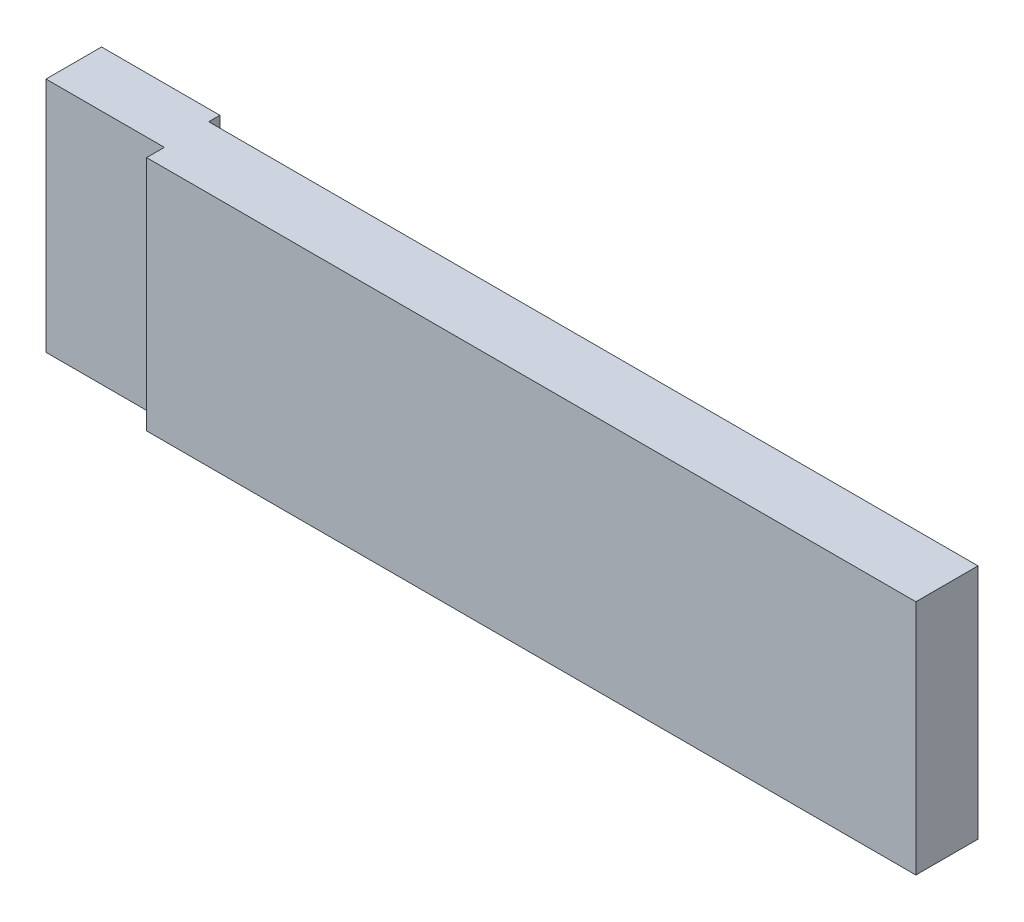
ISO-10303-21;
HEADER;
FILE_DESCRIPTION(('STEP AP214'),'2;1');
FILE_NAME('part.step','',(''),(''),'','','');
FILE_SCHEMA(('AUTOMOTIVE_DESIGN { 1 0 10303 214 1 1 1 1 }'));
ENDSEC;
DATA;
#1=APPLICATION_CONTEXT('core data for automotive mechanical design processes');
#2=APPLICATION_PROTOCOL_DEFINITION('international standard','automotive_design',2000,#1);
#3=PRODUCT_CONTEXT('',#1,'mechanical');
#4=PRODUCT('Part','Part','',(#3));
#5=PRODUCT_RELATED_PRODUCT_CATEGORY('part','',(#4));
#6=PRODUCT_DEFINITION_FORMATION('','',#4);
#7=PRODUCT_DEFINITION_CONTEXT('part definition',#1,'design');
#8=PRODUCT_DEFINITION('design','',#6,#7);
#9=PRODUCT_DEFINITION_SHAPE('','',#8);
#10=(LENGTH_UNIT() NAMED_UNIT(*) SI_UNIT(.MILLI.,.METRE.));
#11=(NAMED_UNIT(*) PLANE_ANGLE_UNIT() SI_UNIT($,.RADIAN.));
#12=(NAMED_UNIT(*) SI_UNIT($,.STERADIAN.) SOLID_ANGLE_UNIT());
#13=UNCERTAINTY_MEASURE_WITH_UNIT(LENGTH_MEASURE(1.E-05),#10,'distance_accuracy_value','');
#14=(GEOMETRIC_REPRESENTATION_CONTEXT(3) GLOBAL_UNCERTAINTY_ASSIGNED_CONTEXT((#13)) GLOBAL_UNIT_ASSIGNED_CONTEXT((#10,
#11,#12)) REPRESENTATION_CONTEXT('',''));
#15=CARTESIAN_POINT('',(0.,0.,0.));
#16=DIRECTION('',(0.,0.,1.));
#17=DIRECTION('',(1.,0.,0.));
#18=AXIS2_PLACEMENT_3D('',#15,#16,#17);
#19=CARTESIAN_POINT('',(7.50000000000001,2.,-1.5));
#20=DIRECTION('',(1.,0.,0.));
#21=DIRECTION('',(0.,1.,0.));
#22=AXIS2_PLACEMENT_3D('',#19,#20,#21);
#23=PLANE('',#22);
#24=DIRECTION('',(0.,1.,0.));
#25=VECTOR('',#24,1.);
#26=CARTESIAN_POINT('',(7.50000000000001,-2.,-0.75));
#27=LINE('',#26,#25);
#28=CARTESIAN_POINT('',(7.50000000000001,-2.,-0.75));
#29=VERTEX_POINT('',#28);
#30=CARTESIAN_POINT('',(7.50000000000001,2.,-0.75));
#31=VERTEX_POINT('',#30);
#32=EDGE_CURVE('E108',#29,#31,#27,.T.);
#33=ORIENTED_EDGE('',*,*,#32,.T.);
#34=DIRECTION('',(0.,0.,1.));
#35=VECTOR('',#34,1.);
#36=CARTESIAN_POINT('',(7.50000000000001,2.,-1.5));
#37=LINE('',#36,#35);
#38=CARTESIAN_POINT('',(7.50000000000001,2.,0.3));
#39=VERTEX_POINT('',#38);
#40=EDGE_CURVE('E39',#31,#39,#37,.T.);
#41=ORIENTED_EDGE('',*,*,#40,.T.);
#42=DIRECTION('',(0.,1.,0.));
#43=VECTOR('',#42,1.);
#44=CARTESIAN_POINT('',(7.50000000000001,2.,0.3));
#45=LINE('',#44,#43);
#46=CARTESIAN_POINT('',(7.50000000000001,-2.,0.3));
#47=VERTEX_POINT('',#46);
#48=EDGE_CURVE('E142',#47,#39,#45,.T.);
#49=ORIENTED_EDGE('',*,*,#48,.F.);
#50=DIRECTION('',(0.,0.,1.));
#51=VECTOR('',#50,1.);
#52=CARTESIAN_POINT('',(7.50000000000001,-2.,-1.5));
#53=LINE('',#52,#51);
#54=EDGE_CURVE('E11',#29,#47,#53,.T.);
#55=ORIENTED_EDGE('',*,*,#54,.F.);
#56=EDGE_LOOP('',(#33,#41,#49,#55));
#57=FACE_BOUND('',#56,.T.);
#58=ADVANCED_FACE('F36',(#57),#23,.T.);
#59=CARTESIAN_POINT('',(-7.49999999999999,-2.,-1.5));
#60=DIRECTION('',(0.,-1.,0.));
#61=DIRECTION('',(0.,0.,-1.));
#62=AXIS2_PLACEMENT_3D('',#59,#60,#61);
#63=PLANE('',#62);
#64=DIRECTION('',(1.,0.,0.));
#65=VECTOR('',#64,1.);
#66=CARTESIAN_POINT('',(-5.49999999999999,-2.,-0.938702511957461));
#67=LINE('',#66,#65);
#68=CARTESIAN_POINT('',(-7.49999999999999,-2.,-0.938702511957461));
#69=VERTEX_POINT('',#68);
#70=CARTESIAN_POINT('',(-5.49999999999999,-2.,-0.938702511957461));
#71=VERTEX_POINT('',#70);
#72=EDGE_CURVE('E109',#69,#71,#67,.T.);
#73=ORIENTED_EDGE('',*,*,#72,.T.);
#74=DIRECTION('',(0.,0.,1.));
#75=VECTOR('',#74,1.);
#76=CARTESIAN_POINT('',(-5.49999999999999,-2.,-0.75));
#77=LINE('',#76,#75);
#78=CARTESIAN_POINT('',(-5.49999999999999,-2.,-0.75));
#79=VERTEX_POINT('',#78);
#80=EDGE_CURVE('E104',#71,#79,#77,.T.);
#81=ORIENTED_EDGE('',*,*,#80,.T.);
#82=DIRECTION('',(1.,0.,0.));
#83=VECTOR('',#82,1.);
#84=CARTESIAN_POINT('',(7.50000000000001,-2.,-0.75));
#85=LINE('',#84,#83);
#86=EDGE_CURVE('E112',#79,#29,#85,.T.);
#87=ORIENTED_EDGE('',*,*,#86,.T.);
#88=ORIENTED_EDGE('',*,*,#54,.T.);
#89=DIRECTION('',(1.,0.,0.));
#90=VECTOR('',#89,1.);
#91=CARTESIAN_POINT('',(7.50000000000001,-2.,0.3));
#92=LINE('',#91,#90);
#93=CARTESIAN_POINT('',(-5.5,-2.,0.3));
#94=VERTEX_POINT('',#93);
#95=EDGE_CURVE('E139',#94,#47,#92,.T.);
#96=ORIENTED_EDGE('',*,*,#95,.F.);
#97=DIRECTION('',(0.,0.,-1.));
#98=VECTOR('',#97,1.);
#99=CARTESIAN_POINT('',(-5.5,-2.,0.3));
#100=LINE('',#99,#98);
#101=CARTESIAN_POINT('',(-5.5,-2.,0.));
#102=VERTEX_POINT('',#101);
#103=EDGE_CURVE('E145',#94,#102,#100,.T.);
#104=ORIENTED_EDGE('',*,*,#103,.T.);
#105=DIRECTION('',(1.,0.,0.));
#106=VECTOR('',#105,1.);
#107=CARTESIAN_POINT('',(-7.49999999999999,-2.,0.));
#108=LINE('',#107,#106);
#109=CARTESIAN_POINT('',(-7.49999999999999,-2.,0.));
#110=VERTEX_POINT('',#109);
#111=EDGE_CURVE('E157',#110,#102,#108,.T.);
#112=ORIENTED_EDGE('',*,*,#111,.F.);
#113=DIRECTION('',(0.,0.,1.));
#114=VECTOR('',#113,1.);
#115=CARTESIAN_POINT('',(-7.49999999999999,-2.,-1.5));
#116=LINE('',#115,#114);
#117=EDGE_CURVE('E44',#69,#110,#116,.T.);
#118=ORIENTED_EDGE('',*,*,#117,.F.);
#119=EDGE_LOOP('',(#73,#81,#87,#88,#96,#104,#112,#118));
#120=FACE_BOUND('',#119,.T.);
#121=ADVANCED_FACE('F118',(#120),#63,.T.);
#122=CARTESIAN_POINT('',(-7.49999999999999,2.,-1.5));
#123=DIRECTION('',(-1.,0.,0.));
#124=DIRECTION('',(0.,-1.,0.));
#125=AXIS2_PLACEMENT_3D('',#122,#123,#124);
#126=PLANE('',#125);
#127=DIRECTION('',(0.,-1.,0.));
#128=VECTOR('',#127,1.);
#129=CARTESIAN_POINT('',(-7.49999999999999,2.,0.));
#130=LINE('',#129,#128);
#131=CARTESIAN_POINT('',(-7.49999999999999,2.,0.));
#132=VERTEX_POINT('',#131);
#133=EDGE_CURVE('E154',#132,#110,#130,.T.);
#134=ORIENTED_EDGE('',*,*,#133,.F.);
#135=DIRECTION('',(0.,0.,1.));
#136=VECTOR('',#135,1.);
#137=CARTESIAN_POINT('',(-7.49999999999999,2.,-1.5));
#138=LINE('',#137,#136);
#139=CARTESIAN_POINT('',(-7.49999999999999,2.,-0.938702511957461));
#140=VERTEX_POINT('',#139);
#141=EDGE_CURVE('E159',#140,#132,#138,.T.);
#142=ORIENTED_EDGE('',*,*,#141,.F.);
#143=DIRECTION('',(0.,1.,0.));
#144=VECTOR('',#143,1.);
#145=CARTESIAN_POINT('',(-7.49999999999999,-2.,-0.938702511957461));
#146=LINE('',#145,#144);
#147=EDGE_CURVE('E131',#69,#140,#146,.T.);
#148=ORIENTED_EDGE('',*,*,#147,.F.);
#149=ORIENTED_EDGE('',*,*,#117,.T.);
#150=EDGE_LOOP('',(#134,#142,#148,#149));
#151=FACE_BOUND('',#150,.T.);
#152=ADVANCED_FACE('F179',(#151),#126,.T.);
#153=CARTESIAN_POINT('',(-7.49999999999999,2.,-1.5));
#154=DIRECTION('',(0.,1.,0.));
#155=DIRECTION('',(0.,0.,1.));
#156=AXIS2_PLACEMENT_3D('',#153,#154,#155);
#157=PLANE('',#156);
#158=DIRECTION('',(1.,0.,0.));
#159=VECTOR('',#158,1.);
#160=CARTESIAN_POINT('',(-5.49999999999999,2.,-0.938702511957461));
#161=LINE('',#160,#159);
#162=CARTESIAN_POINT('',(-5.49999999999999,2.,-0.938702511957461));
#163=VERTEX_POINT('',#162);
#164=EDGE_CURVE('E120',#140,#163,#161,.T.);
#165=ORIENTED_EDGE('',*,*,#164,.F.);
#166=ORIENTED_EDGE('',*,*,#141,.T.);
#167=DIRECTION('',(-1.,0.,0.));
#168=VECTOR('',#167,1.);
#169=CARTESIAN_POINT('',(-7.49999999999999,2.,0.));
#170=LINE('',#169,#168);
#171=CARTESIAN_POINT('',(-5.49999999999999,2.,0.));
#172=VERTEX_POINT('',#171);
#173=EDGE_CURVE('E152',#172,#132,#170,.T.);
#174=ORIENTED_EDGE('',*,*,#173,.F.);
#175=DIRECTION('',(0.,0.,-1.));
#176=VECTOR('',#175,1.);
#177=CARTESIAN_POINT('',(-5.49999999999999,2.,0.3));
#178=LINE('',#177,#176);
#179=CARTESIAN_POINT('',(-5.49999999999999,2.,0.3));
#180=VERTEX_POINT('',#179);
#181=EDGE_CURVE('E149',#180,#172,#178,.T.);
#182=ORIENTED_EDGE('',*,*,#181,.F.);
#183=DIRECTION('',(-1.,0.,0.));
#184=VECTOR('',#183,1.);
#185=CARTESIAN_POINT('',(7.50000000000001,2.,0.3));
#186=LINE('',#185,#184);
#187=EDGE_CURVE('E134',#39,#180,#186,.T.);
#188=ORIENTED_EDGE('',*,*,#187,.F.);
#189=ORIENTED_EDGE('',*,*,#40,.F.);
#190=DIRECTION('',(1.,0.,0.));
#191=VECTOR('',#190,1.);
#192=CARTESIAN_POINT('',(7.50000000000001,2.,-0.75));
#193=LINE('',#192,#191);
#194=CARTESIAN_POINT('',(-5.49999999999999,2.,-0.75));
#195=VERTEX_POINT('',#194);
#196=EDGE_CURVE('E123',#195,#31,#193,.T.);
#197=ORIENTED_EDGE('',*,*,#196,.F.);
#198=DIRECTION('',(0.,0.,1.));
#199=VECTOR('',#198,1.);
#200=CARTESIAN_POINT('',(-5.49999999999999,2.,-0.75));
#201=LINE('',#200,#199);
#202=EDGE_CURVE('E52',#163,#195,#201,.T.);
#203=ORIENTED_EDGE('',*,*,#202,.F.);
#204=EDGE_LOOP('',(#165,#166,#174,#182,#188,#189,#197,#203));
#205=FACE_BOUND('',#204,.T.);
#206=ADVANCED_FACE('F171',(#205),#157,.T.);
#207=CARTESIAN_POINT('',(0.,0.,0.));
#208=DIRECTION('',(0.,0.,1.));
#209=DIRECTION('',(1.,0.,0.));
#210=AXIS2_PLACEMENT_3D('',#207,#208,#209);
#211=PLANE('',#210);
#212=DIRECTION('',(0.,-1.,0.));
#213=VECTOR('',#212,1.);
#214=CARTESIAN_POINT('',(-5.49999999999999,2.,0.));
#215=LINE('',#214,#213);
#216=EDGE_CURVE('E60',#172,#102,#215,.T.);
#217=ORIENTED_EDGE('',*,*,#216,.F.);
#218=ORIENTED_EDGE('',*,*,#173,.T.);
#219=ORIENTED_EDGE('',*,*,#133,.T.);
#220=ORIENTED_EDGE('',*,*,#111,.T.);
#221=EDGE_LOOP('',(#217,#218,#219,#220));
#222=FACE_BOUND('',#221,.T.);
#223=ADVANCED_FACE('F176',(#222),#211,.T.);
#224=CARTESIAN_POINT('',(-5.49999999999999,2.,0.3));
#225=DIRECTION('',(1.,0.,0.));
#226=DIRECTION('',(0.,1.,0.));
#227=AXIS2_PLACEMENT_3D('',#224,#225,#226);
#228=PLANE('',#227);
#229=ORIENTED_EDGE('',*,*,#216,.T.);
#230=ORIENTED_EDGE('',*,*,#103,.F.);
#231=DIRECTION('',(0.,-1.,0.));
#232=VECTOR('',#231,1.);
#233=CARTESIAN_POINT('',(-5.49999999999999,2.,0.3));
#234=LINE('',#233,#232);
#235=EDGE_CURVE('E137',#180,#94,#234,.T.);
#236=ORIENTED_EDGE('',*,*,#235,.F.);
#237=ORIENTED_EDGE('',*,*,#181,.T.);
#238=EDGE_LOOP('',(#229,#230,#236,#237));
#239=FACE_BOUND('',#238,.T.);
#240=ADVANCED_FACE('F173',(#239),#228,.F.);
#241=CARTESIAN_POINT('',(0.,0.,0.3));
#242=DIRECTION('',(0.,0.,1.));
#243=DIRECTION('',(1.,0.,0.));
#244=AXIS2_PLACEMENT_3D('',#241,#242,#243);
#245=PLANE('',#244);
#246=ORIENTED_EDGE('',*,*,#187,.T.);
#247=ORIENTED_EDGE('',*,*,#235,.T.);
#248=ORIENTED_EDGE('',*,*,#95,.T.);
#249=ORIENTED_EDGE('',*,*,#48,.T.);
#250=EDGE_LOOP('',(#246,#247,#248,#249));
#251=FACE_BOUND('',#250,.T.);
#252=ADVANCED_FACE('F168',(#251),#245,.T.);
#253=CARTESIAN_POINT('',(-5.49999999999999,-2.,-0.75));
#254=DIRECTION('',(-1.,0.,0.));
#255=DIRECTION('',(0.,0.,1.));
#256=AXIS2_PLACEMENT_3D('',#253,#254,#255);
#257=PLANE('',#256);
#258=ORIENTED_EDGE('',*,*,#202,.T.);
#259=DIRECTION('',(0.,1.,0.));
#260=VECTOR('',#259,1.);
#261=CARTESIAN_POINT('',(-5.49999999999999,-2.,-0.75));
#262=LINE('',#261,#260);
#263=EDGE_CURVE('E100',#79,#195,#262,.T.);
#264=ORIENTED_EDGE('',*,*,#263,.F.);
#265=ORIENTED_EDGE('',*,*,#80,.F.);
#266=DIRECTION('',(0.,1.,0.));
#267=VECTOR('',#266,1.);
#268=CARTESIAN_POINT('',(-5.49999999999999,-2.,-0.938702511957461));
#269=LINE('',#268,#267);
#270=EDGE_CURVE('E129',#71,#163,#269,.T.);
#271=ORIENTED_EDGE('',*,*,#270,.T.);
#272=EDGE_LOOP('',(#258,#264,#265,#271));
#273=FACE_BOUND('',#272,.T.);
#274=ADVANCED_FACE('F102',(#273),#257,.F.);
#275=CARTESIAN_POINT('',(-5.49999999999999,-2.,-0.938702511957461));
#276=DIRECTION('',(0.,0.,1.));
#277=DIRECTION('',(1.,0.,0.));
#278=AXIS2_PLACEMENT_3D('',#275,#276,#277);
#279=PLANE('',#278);
#280=ORIENTED_EDGE('',*,*,#164,.T.);
#281=ORIENTED_EDGE('',*,*,#270,.F.);
#282=ORIENTED_EDGE('',*,*,#72,.F.);
#283=ORIENTED_EDGE('',*,*,#147,.T.);
#284=EDGE_LOOP('',(#280,#281,#282,#283));
#285=FACE_BOUND('',#284,.T.);
#286=ADVANCED_FACE('F182',(#285),#279,.F.);
#287=CARTESIAN_POINT('',(7.50000000000001,-2.,-0.75));
#288=DIRECTION('',(0.,0.,1.));
#289=DIRECTION('',(1.,0.,0.));
#290=AXIS2_PLACEMENT_3D('',#287,#288,#289);
#291=PLANE('',#290);
#292=ORIENTED_EDGE('',*,*,#196,.T.);
#293=ORIENTED_EDGE('',*,*,#32,.F.);
#294=ORIENTED_EDGE('',*,*,#86,.F.);
#295=ORIENTED_EDGE('',*,*,#263,.T.);
#296=EDGE_LOOP('',(#292,#293,#294,#295));
#297=FACE_BOUND('',#296,.T.);
#298=ADVANCED_FACE('F113',(#297),#291,.F.);
#299=CLOSED_SHELL('',(#58,#121,#152,#206,#223,#240,#252,#274,#286,#298));
#300=MANIFOLD_SOLID_BREP('B2',#299);
#301=ADVANCED_BREP_SHAPE_REPRESENTATION('',(#18,#300),#14);
#302=SHAPE_DEFINITION_REPRESENTATION(#9,#301);
ENDSEC;
END-ISO-10303-21;
